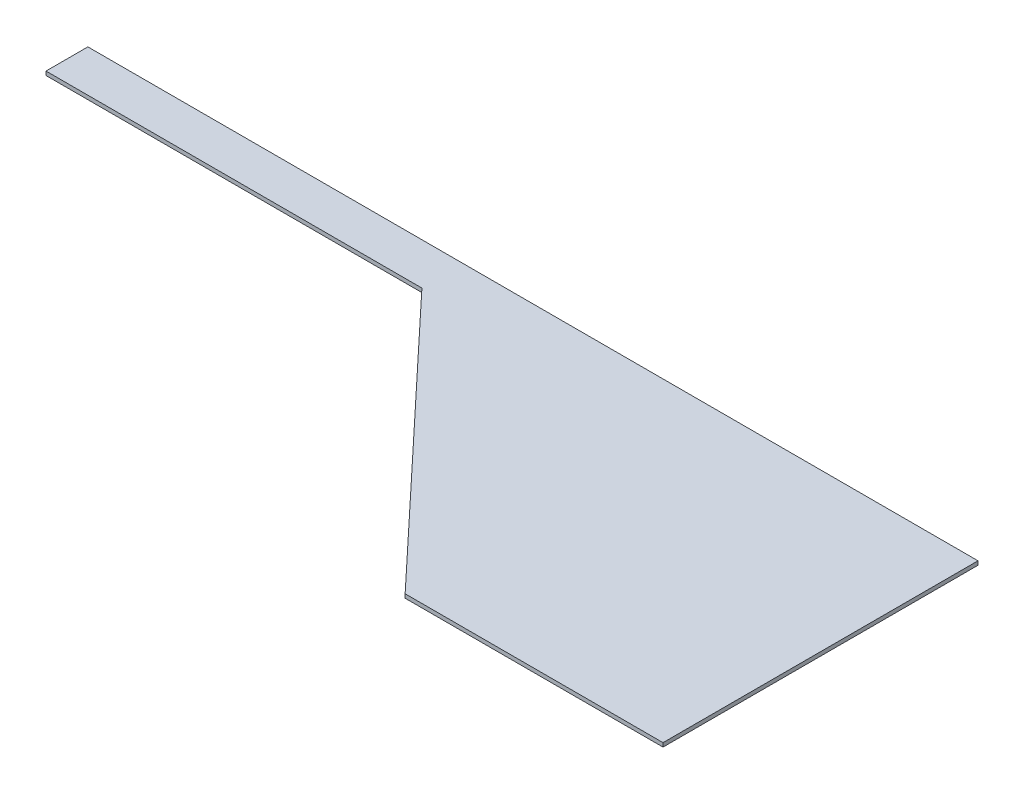
ISO-10303-21;
HEADER;
FILE_DESCRIPTION(('STEP AP214'),'2;1');
FILE_NAME('part.step','',(''),(''),'','','');
FILE_SCHEMA(('AUTOMOTIVE_DESIGN { 1 0 10303 214 1 1 1 1 }'));
ENDSEC;
DATA;
#1=APPLICATION_CONTEXT('core data for automotive mechanical design processes');
#2=APPLICATION_PROTOCOL_DEFINITION('international standard','automotive_design',2000,#1);
#3=PRODUCT_CONTEXT('',#1,'mechanical');
#4=PRODUCT('Part','Part','',(#3));
#5=PRODUCT_RELATED_PRODUCT_CATEGORY('part','',(#4));
#6=PRODUCT_DEFINITION_FORMATION('','',#4);
#7=PRODUCT_DEFINITION_CONTEXT('part definition',#1,'design');
#8=PRODUCT_DEFINITION('design','',#6,#7);
#9=PRODUCT_DEFINITION_SHAPE('','',#8);
#10=(LENGTH_UNIT() NAMED_UNIT(*) SI_UNIT(.MILLI.,.METRE.));
#11=(NAMED_UNIT(*) PLANE_ANGLE_UNIT() SI_UNIT($,.RADIAN.));
#12=(NAMED_UNIT(*) SI_UNIT($,.STERADIAN.) SOLID_ANGLE_UNIT());
#13=UNCERTAINTY_MEASURE_WITH_UNIT(LENGTH_MEASURE(1.E-05),#10,'distance_accuracy_value','');
#14=(GEOMETRIC_REPRESENTATION_CONTEXT(3) GLOBAL_UNCERTAINTY_ASSIGNED_CONTEXT((#13)) GLOBAL_UNIT_ASSIGNED_CONTEXT((#10,
#11,#12)) REPRESENTATION_CONTEXT('',''));
#15=CARTESIAN_POINT('',(0.,0.,0.));
#16=DIRECTION('',(0.,0.,1.));
#17=DIRECTION('',(1.,0.,0.));
#18=AXIS2_PLACEMENT_3D('',#15,#16,#17);
#19=CARTESIAN_POINT('',(51.,75.8919626313153,10.7712382075354));
#20=DIRECTION('',(1.,0.,0.));
#21=DIRECTION('',(0.,0.,-1.));
#22=AXIS2_PLACEMENT_3D('',#19,#20,#21);
#23=PLANE('',#22);
#24=DIRECTION('',(0.,0.,-1.));
#25=VECTOR('',#24,1.);
#26=CARTESIAN_POINT('',(51.,74.8919626313153,10.7712382075354));
#27=LINE('',#26,#25);
#28=CARTESIAN_POINT('',(51.,74.8919626313153,10.7712382075354));
#29=VERTEX_POINT('',#28);
#30=CARTESIAN_POINT('',(51.,74.8919626313153,0.));
#31=VERTEX_POINT('',#30);
#32=EDGE_CURVE('E121',#29,#31,#27,.T.);
#33=ORIENTED_EDGE('',*,*,#32,.F.);
#34=DIRECTION('',(0.,-1.,0.));
#35=VECTOR('',#34,1.);
#36=CARTESIAN_POINT('',(51.,75.8919626313153,10.7712382075354));
#37=LINE('',#36,#35);
#38=CARTESIAN_POINT('',(51.,75.8919626313153,10.7712382075354));
#39=VERTEX_POINT('',#38);
#40=EDGE_CURVE('E120',#39,#29,#37,.T.);
#41=ORIENTED_EDGE('',*,*,#40,.F.);
#42=DIRECTION('',(0.,0.,-1.));
#43=VECTOR('',#42,1.);
#44=CARTESIAN_POINT('',(51.,75.8919626313153,10.7712382075354));
#45=LINE('',#44,#43);
#46=CARTESIAN_POINT('',(51.,75.8919626313153,0.));
#47=VERTEX_POINT('',#46);
#48=EDGE_CURVE('E133',#39,#47,#45,.T.);
#49=ORIENTED_EDGE('',*,*,#48,.T.);
#50=DIRECTION('',(0.,-1.,0.));
#51=VECTOR('',#50,1.);
#52=CARTESIAN_POINT('',(51.,75.8919626313153,0.));
#53=LINE('',#52,#51);
#54=EDGE_CURVE('E11',#47,#31,#53,.T.);
#55=ORIENTED_EDGE('',*,*,#54,.T.);
#56=EDGE_LOOP('',(#33,#41,#49,#55));
#57=FACE_BOUND('',#56,.T.);
#58=ADVANCED_FACE('F38',(#57),#23,.F.);
#59=CARTESIAN_POINT('',(51.,75.8919626313153,0.));
#60=DIRECTION('',(0.,0.,1.));
#61=DIRECTION('',(1.,0.,0.));
#62=AXIS2_PLACEMENT_3D('',#59,#60,#61);
#63=PLANE('',#62);
#64=DIRECTION('',(1.,0.,0.));
#65=VECTOR('',#64,1.);
#66=CARTESIAN_POINT('',(51.,74.8919626313153,0.));
#67=LINE('',#66,#65);
#68=CARTESIAN_POINT('',(280.,74.8919626313153,0.));
#69=VERTEX_POINT('',#68);
#70=EDGE_CURVE('E123',#31,#69,#67,.T.);
#71=ORIENTED_EDGE('',*,*,#70,.F.);
#72=ORIENTED_EDGE('',*,*,#54,.F.);
#73=DIRECTION('',(1.,0.,0.));
#74=VECTOR('',#73,1.);
#75=CARTESIAN_POINT('',(51.,75.8919626313153,0.));
#76=LINE('',#75,#74);
#77=CARTESIAN_POINT('',(280.,75.8919626313153,0.));
#78=VERTEX_POINT('',#77);
#79=EDGE_CURVE('E86',#47,#78,#76,.T.);
#80=ORIENTED_EDGE('',*,*,#79,.T.);
#81=DIRECTION('',(0.,-1.,0.));
#82=VECTOR('',#81,1.);
#83=CARTESIAN_POINT('',(280.,75.8919626313153,0.));
#84=LINE('',#83,#82);
#85=EDGE_CURVE('E46',#78,#69,#84,.T.);
#86=ORIENTED_EDGE('',*,*,#85,.T.);
#87=EDGE_LOOP('',(#71,#72,#80,#86));
#88=FACE_BOUND('',#87,.T.);
#89=ADVANCED_FACE('F139',(#88),#63,.F.);
#90=CARTESIAN_POINT('',(280.,75.8919626313153,0.));
#91=DIRECTION('',(-1.,0.,0.));
#92=DIRECTION('',(0.,0.,1.));
#93=AXIS2_PLACEMENT_3D('',#90,#91,#92);
#94=PLANE('',#93);
#95=DIRECTION('',(0.,0.,1.));
#96=VECTOR('',#95,1.);
#97=CARTESIAN_POINT('',(280.,74.8919626313153,0.));
#98=LINE('',#97,#96);
#99=CARTESIAN_POINT('',(280.,74.8919626313153,81.035636223129));
#100=VERTEX_POINT('',#99);
#101=EDGE_CURVE('E126',#69,#100,#98,.T.);
#102=ORIENTED_EDGE('',*,*,#101,.F.);
#103=ORIENTED_EDGE('',*,*,#85,.F.);
#104=DIRECTION('',(0.,0.,1.));
#105=VECTOR('',#104,1.);
#106=CARTESIAN_POINT('',(280.,75.8919626313153,0.));
#107=LINE('',#106,#105);
#108=CARTESIAN_POINT('',(280.,75.8919626313153,81.035636223129));
#109=VERTEX_POINT('',#108);
#110=EDGE_CURVE('E114',#78,#109,#107,.T.);
#111=ORIENTED_EDGE('',*,*,#110,.T.);
#112=DIRECTION('',(0.,-1.,0.));
#113=VECTOR('',#112,1.);
#114=CARTESIAN_POINT('',(280.,75.8919626313153,81.035636223129));
#115=LINE('',#114,#113);
#116=EDGE_CURVE('E108',#109,#100,#115,.T.);
#117=ORIENTED_EDGE('',*,*,#116,.T.);
#118=EDGE_LOOP('',(#102,#103,#111,#117));
#119=FACE_BOUND('',#118,.T.);
#120=ADVANCED_FACE('F161',(#119),#94,.F.);
#121=CARTESIAN_POINT('',(213.658520423811,75.8919626313153,81.035636223129));
#122=DIRECTION('',(0.,0.,-1.));
#123=DIRECTION('',(-1.,0.,0.));
#124=AXIS2_PLACEMENT_3D('',#121,#122,#123);
#125=PLANE('',#124);
#126=DIRECTION('',(-1.,0.,0.));
#127=VECTOR('',#126,1.);
#128=CARTESIAN_POINT('',(213.658520423811,74.8919626313153,81.035636223129));
#129=LINE('',#128,#127);
#130=CARTESIAN_POINT('',(213.658520423811,74.8919626313153,81.035636223129));
#131=VERTEX_POINT('',#130);
#132=EDGE_CURVE('E129',#100,#131,#129,.T.);
#133=ORIENTED_EDGE('',*,*,#132,.F.);
#134=ORIENTED_EDGE('',*,*,#116,.F.);
#135=DIRECTION('',(-1.,0.,0.));
#136=VECTOR('',#135,1.);
#137=CARTESIAN_POINT('',(213.658520423811,75.8919626313153,81.035636223129));
#138=LINE('',#137,#136);
#139=CARTESIAN_POINT('',(213.658520423811,75.8919626313153,81.035636223129));
#140=VERTEX_POINT('',#139);
#141=EDGE_CURVE('E98',#109,#140,#138,.T.);
#142=ORIENTED_EDGE('',*,*,#141,.T.);
#143=DIRECTION('',(0.,-1.,0.));
#144=VECTOR('',#143,1.);
#145=CARTESIAN_POINT('',(213.658520423811,75.8919626313153,81.035636223129));
#146=LINE('',#145,#144);
#147=EDGE_CURVE('E103',#140,#131,#146,.T.);
#148=ORIENTED_EDGE('',*,*,#147,.T.);
#149=EDGE_LOOP('',(#133,#134,#142,#148));
#150=FACE_BOUND('',#149,.T.);
#151=ADVANCED_FACE('F111',(#150),#125,.F.);
#152=CARTESIAN_POINT('',(147.705868366748,75.8919626313153,10.7712382075354));
#153=DIRECTION('',(0.729124004211731,0.,-0.684381608813571));
#154=DIRECTION('',(-0.684381608813571,0.,-0.729124004211731));
#155=AXIS2_PLACEMENT_3D('',#152,#153,#154);
#156=PLANE('',#155);
#157=DIRECTION('',(-0.684381608813571,0.,-0.729124004211731));
#158=VECTOR('',#157,1.);
#159=CARTESIAN_POINT('',(147.705868366748,74.8919626313153,10.7712382075354));
#160=LINE('',#159,#158);
#161=CARTESIAN_POINT('',(147.705868366748,74.8919626313153,10.7712382075354));
#162=VERTEX_POINT('',#161);
#163=EDGE_CURVE('E105',#131,#162,#160,.T.);
#164=ORIENTED_EDGE('',*,*,#163,.F.);
#165=ORIENTED_EDGE('',*,*,#147,.F.);
#166=DIRECTION('',(-0.684381608813571,0.,-0.729124004211731));
#167=VECTOR('',#166,1.);
#168=CARTESIAN_POINT('',(147.705868366748,75.8919626313153,10.7712382075354));
#169=LINE('',#168,#167);
#170=CARTESIAN_POINT('',(147.705868366748,75.8919626313153,10.7712382075354));
#171=VERTEX_POINT('',#170);
#172=EDGE_CURVE('E94',#140,#171,#169,.T.);
#173=ORIENTED_EDGE('',*,*,#172,.T.);
#174=DIRECTION('',(0.,-1.,0.));
#175=VECTOR('',#174,1.);
#176=CARTESIAN_POINT('',(147.705868366748,75.8919626313153,10.7712382075354));
#177=LINE('',#176,#175);
#178=EDGE_CURVE('E109',#171,#162,#177,.T.);
#179=ORIENTED_EDGE('',*,*,#178,.T.);
#180=EDGE_LOOP('',(#164,#165,#173,#179));
#181=FACE_BOUND('',#180,.T.);
#182=ADVANCED_FACE('F104',(#181),#156,.F.);
#183=CARTESIAN_POINT('',(51.,75.8919626313153,10.7712382075354));
#184=DIRECTION('',(0.,0.,-1.));
#185=DIRECTION('',(-1.,0.,0.));
#186=AXIS2_PLACEMENT_3D('',#183,#184,#185);
#187=PLANE('',#186);
#188=DIRECTION('',(-1.,0.,0.));
#189=VECTOR('',#188,1.);
#190=CARTESIAN_POINT('',(51.,74.8919626313153,10.7712382075354));
#191=LINE('',#190,#189);
#192=EDGE_CURVE('E74',#162,#29,#191,.T.);
#193=ORIENTED_EDGE('',*,*,#192,.F.);
#194=ORIENTED_EDGE('',*,*,#178,.F.);
#195=DIRECTION('',(-1.,0.,0.));
#196=VECTOR('',#195,1.);
#197=CARTESIAN_POINT('',(51.,75.8919626313153,10.7712382075354));
#198=LINE('',#197,#196);
#199=EDGE_CURVE('E54',#171,#39,#198,.T.);
#200=ORIENTED_EDGE('',*,*,#199,.T.);
#201=ORIENTED_EDGE('',*,*,#40,.T.);
#202=EDGE_LOOP('',(#193,#194,#200,#201));
#203=FACE_BOUND('',#202,.T.);
#204=ADVANCED_FACE('F147',(#203),#187,.F.);
#205=CARTESIAN_POINT('',(0.,75.8919626313153,0.));
#206=DIRECTION('',(0.,1.,0.));
#207=DIRECTION('',(0.,0.,-1.));
#208=AXIS2_PLACEMENT_3D('',#205,#206,#207);
#209=PLANE('',#208);
#210=ORIENTED_EDGE('',*,*,#48,.F.);
#211=ORIENTED_EDGE('',*,*,#199,.F.);
#212=ORIENTED_EDGE('',*,*,#172,.F.);
#213=ORIENTED_EDGE('',*,*,#141,.F.);
#214=ORIENTED_EDGE('',*,*,#110,.F.);
#215=ORIENTED_EDGE('',*,*,#79,.F.);
#216=EDGE_LOOP('',(#210,#211,#212,#213,#214,#215));
#217=FACE_BOUND('',#216,.T.);
#218=ADVANCED_FACE('F96',(#217),#209,.T.);
#219=CARTESIAN_POINT('',(0.,74.8919626313153,0.));
#220=DIRECTION('',(0.,1.,0.));
#221=DIRECTION('',(0.,0.,-1.));
#222=AXIS2_PLACEMENT_3D('',#219,#220,#221);
#223=PLANE('',#222);
#224=ORIENTED_EDGE('',*,*,#32,.T.);
#225=ORIENTED_EDGE('',*,*,#70,.T.);
#226=ORIENTED_EDGE('',*,*,#101,.T.);
#227=ORIENTED_EDGE('',*,*,#132,.T.);
#228=ORIENTED_EDGE('',*,*,#163,.T.);
#229=ORIENTED_EDGE('',*,*,#192,.T.);
#230=EDGE_LOOP('',(#224,#225,#226,#227,#228,#229));
#231=FACE_BOUND('',#230,.T.);
#232=ADVANCED_FACE('F141',(#231),#223,.F.);
#233=CLOSED_SHELL('',(#58,#89,#120,#151,#182,#204,#218,#232));
#234=MANIFOLD_SOLID_BREP('B2',#233);
#235=ADVANCED_BREP_SHAPE_REPRESENTATION('',(#18,#234),#14);
#236=SHAPE_DEFINITION_REPRESENTATION(#9,#235);
ENDSEC;
END-ISO-10303-21;
